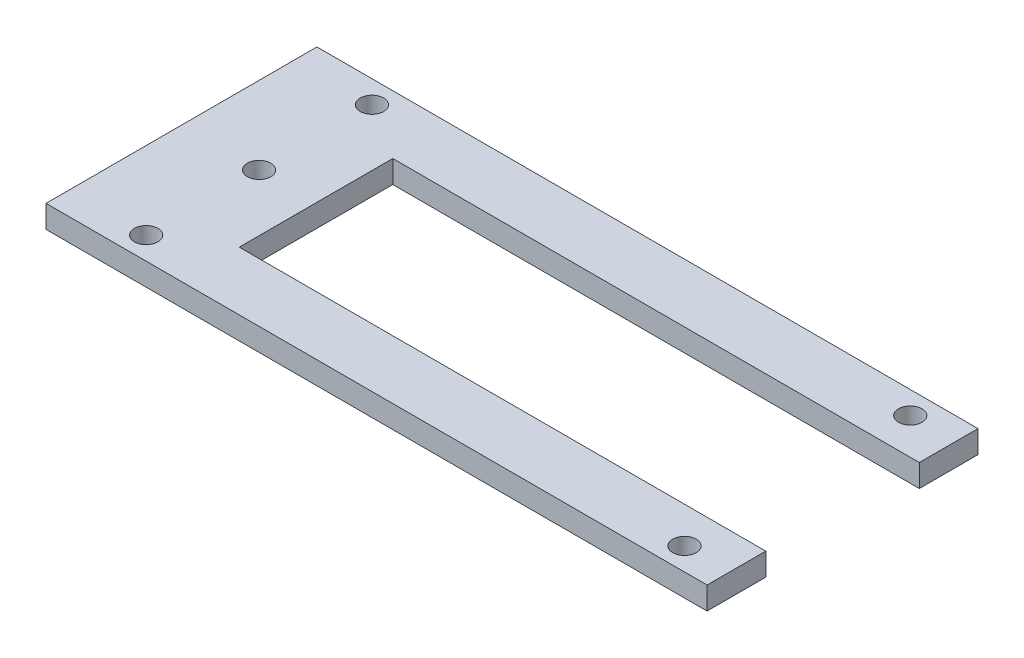
ISO-10303-21;
HEADER;
FILE_DESCRIPTION(('STEP AP214'),'2;1');
FILE_NAME('part.step','',(''),(''),'','','');
FILE_SCHEMA(('AUTOMOTIVE_DESIGN { 1 0 10303 214 1 1 1 1 }'));
ENDSEC;
DATA;
#1=APPLICATION_CONTEXT('core data for automotive mechanical design processes');
#2=APPLICATION_PROTOCOL_DEFINITION('international standard','automotive_design',2000,#1);
#3=PRODUCT_CONTEXT('',#1,'mechanical');
#4=PRODUCT('Part','Part','',(#3));
#5=PRODUCT_RELATED_PRODUCT_CATEGORY('part','',(#4));
#6=PRODUCT_DEFINITION_FORMATION('','',#4);
#7=PRODUCT_DEFINITION_CONTEXT('part definition',#1,'design');
#8=PRODUCT_DEFINITION('design','',#6,#7);
#9=PRODUCT_DEFINITION_SHAPE('','',#8);
#10=(LENGTH_UNIT() NAMED_UNIT(*) SI_UNIT(.MILLI.,.METRE.));
#11=(NAMED_UNIT(*) PLANE_ANGLE_UNIT() SI_UNIT($,.RADIAN.));
#12=(NAMED_UNIT(*) SI_UNIT($,.STERADIAN.) SOLID_ANGLE_UNIT());
#13=UNCERTAINTY_MEASURE_WITH_UNIT(LENGTH_MEASURE(1.E-05),#10,'distance_accuracy_value','');
#14=(GEOMETRIC_REPRESENTATION_CONTEXT(3) GLOBAL_UNCERTAINTY_ASSIGNED_CONTEXT((#13)) GLOBAL_UNIT_ASSIGNED_CONTEXT((#10,
#11,#12)) REPRESENTATION_CONTEXT('',''));
#15=CARTESIAN_POINT('',(0.,0.,0.));
#16=DIRECTION('',(0.,0.,1.));
#17=DIRECTION('',(1.,0.,0.));
#18=AXIS2_PLACEMENT_3D('',#15,#16,#17);
#19=CARTESIAN_POINT('',(46.482,3.175,19.05));
#20=DIRECTION('',(-1.,0.,0.));
#21=DIRECTION('',(0.,0.,1.));
#22=AXIS2_PLACEMENT_3D('',#19,#20,#21);
#23=PLANE('',#22);
#24=DIRECTION('',(0.,0.,-1.));
#25=VECTOR('',#24,1.);
#26=CARTESIAN_POINT('',(46.482,3.175,19.05));
#27=LINE('',#26,#25);
#28=CARTESIAN_POINT('',(46.482,3.175,-10.795));
#29=VERTEX_POINT('',#28);
#30=CARTESIAN_POINT('',(46.482,3.175,-19.05));
#31=VERTEX_POINT('',#30);
#32=EDGE_CURVE('E85',#29,#31,#27,.T.);
#33=ORIENTED_EDGE('',*,*,#32,.F.);
#34=DIRECTION('',(0.,1.,0.));
#35=VECTOR('',#34,1.);
#36=CARTESIAN_POINT('',(46.482,-77.1245601673034,-10.795));
#37=LINE('',#36,#35);
#38=CARTESIAN_POINT('',(46.482,0.,-10.795));
#39=VERTEX_POINT('',#38);
#40=EDGE_CURVE('E141',#39,#29,#37,.T.);
#41=ORIENTED_EDGE('',*,*,#40,.F.);
#42=DIRECTION('',(0.,0.,-1.));
#43=VECTOR('',#42,1.);
#44=CARTESIAN_POINT('',(46.482,0.,19.05));
#45=LINE('',#44,#43);
#46=CARTESIAN_POINT('',(46.482,0.,-19.05));
#47=VERTEX_POINT('',#46);
#48=EDGE_CURVE('E130',#39,#47,#45,.T.);
#49=ORIENTED_EDGE('',*,*,#48,.T.);
#50=DIRECTION('',(0.,-1.,0.));
#51=VECTOR('',#50,1.);
#52=CARTESIAN_POINT('',(46.482,3.175,-19.05));
#53=LINE('',#52,#51);
#54=EDGE_CURVE('E11',#31,#47,#53,.T.);
#55=ORIENTED_EDGE('',*,*,#54,.F.);
#56=EDGE_LOOP('',(#33,#41,#49,#55));
#57=FACE_BOUND('',#56,.T.);
#58=ADVANCED_FACE('F33',(#57),#23,.F.);
#59=CARTESIAN_POINT('',(0.,3.175,0.));
#60=DIRECTION('',(0.,-1.,0.));
#61=DIRECTION('',(0.,0.,-1.));
#62=AXIS2_PLACEMENT_3D('',#59,#60,#61);
#63=PLANE('',#62);
#64=CARTESIAN_POINT('',(40.132,3.175,15.875));
#65=DIRECTION('',(0.,1.,0.));
#66=DIRECTION('',(0.,0.,1.));
#67=AXIS2_PLACEMENT_3D('',#64,#65,#66);
#68=CIRCLE('',#67,1.65099999999997);
#69=CARTESIAN_POINT('',(40.132,3.175,17.526));
#70=VERTEX_POINT('',#69);
#71=EDGE_CURVE('E151',#70,#70,#68,.T.);
#72=ORIENTED_EDGE('',*,*,#71,.F.);
#73=EDGE_LOOP('',(#72));
#74=FACE_BOUND('',#73,.T.);
#75=CARTESIAN_POINT('',(-35.5676927405971,3.175,-15.875));
#76=DIRECTION('',(0.,1.,0.));
#77=DIRECTION('',(0.,0.,1.));
#78=AXIS2_PLACEMENT_3D('',#75,#76,#77);
#79=CIRCLE('',#78,1.65099999999997);
#80=CARTESIAN_POINT('',(-35.5676927405971,3.175,-14.224));
#81=VERTEX_POINT('',#80);
#82=EDGE_CURVE('E163',#81,#81,#79,.T.);
#83=ORIENTED_EDGE('',*,*,#82,.F.);
#84=EDGE_LOOP('',(#83));
#85=FACE_BOUND('',#84,.T.);
#86=DIRECTION('',(0.,0.,1.));
#87=VECTOR('',#86,1.);
#88=CARTESIAN_POINT('',(-27.559,3.175,-10.795));
#89=LINE('',#88,#87);
#90=CARTESIAN_POINT('',(-27.559,3.175,-10.795));
#91=VERTEX_POINT('',#90);
#92=CARTESIAN_POINT('',(-27.559,3.175,10.795));
#93=VERTEX_POINT('',#92);
#94=EDGE_CURVE('E132',#91,#93,#89,.T.);
#95=ORIENTED_EDGE('',*,*,#94,.F.);
#96=DIRECTION('',(-1.,0.,0.));
#97=VECTOR('',#96,1.);
#98=CARTESIAN_POINT('',(46.482,3.175,-10.795));
#99=LINE('',#98,#97);
#100=EDGE_CURVE('E123',#29,#91,#99,.T.);
#101=ORIENTED_EDGE('',*,*,#100,.F.);
#102=ORIENTED_EDGE('',*,*,#32,.T.);
#103=DIRECTION('',(-1.,0.,0.));
#104=VECTOR('',#103,1.);
#105=CARTESIAN_POINT('',(-46.482,3.175,-19.05));
#106=LINE('',#105,#104);
#107=CARTESIAN_POINT('',(-46.482,3.175,-19.05));
#108=VERTEX_POINT('',#107);
#109=EDGE_CURVE('E176',#31,#108,#106,.T.);
#110=ORIENTED_EDGE('',*,*,#109,.T.);
#111=DIRECTION('',(0.,0.,1.));
#112=VECTOR('',#111,1.);
#113=CARTESIAN_POINT('',(-46.482,3.175,19.05));
#114=LINE('',#113,#112);
#115=CARTESIAN_POINT('',(-46.482,3.175,19.05));
#116=VERTEX_POINT('',#115);
#117=EDGE_CURVE('E178',#108,#116,#114,.T.);
#118=ORIENTED_EDGE('',*,*,#117,.T.);
#119=DIRECTION('',(1.,0.,0.));
#120=VECTOR('',#119,1.);
#121=CARTESIAN_POINT('',(-46.482,3.175,19.05));
#122=LINE('',#121,#120);
#123=CARTESIAN_POINT('',(46.482,3.175,19.05));
#124=VERTEX_POINT('',#123);
#125=EDGE_CURVE('E57',#116,#124,#122,.T.);
#126=ORIENTED_EDGE('',*,*,#125,.T.);
#127=CARTESIAN_POINT('',(46.482,3.175,10.795));
#128=VERTEX_POINT('',#127);
#129=EDGE_CURVE('E174',#124,#128,#27,.T.);
#130=ORIENTED_EDGE('',*,*,#129,.T.);
#131=DIRECTION('',(1.,0.,0.));
#132=VECTOR('',#131,1.);
#133=CARTESIAN_POINT('',(46.482,3.175,10.795));
#134=LINE('',#133,#132);
#135=EDGE_CURVE('E48',#93,#128,#134,.T.);
#136=ORIENTED_EDGE('',*,*,#135,.F.);
#137=EDGE_LOOP('',(#95,#101,#102,#110,#118,#126,#130,#136));
#138=FACE_BOUND('',#137,.T.);
#139=CARTESIAN_POINT('',(-35.5676927405971,3.175,15.875));
#140=DIRECTION('',(0.,1.,0.));
#141=DIRECTION('',(0.,0.,1.));
#142=AXIS2_PLACEMENT_3D('',#139,#140,#141);
#143=CIRCLE('',#142,1.65099999999997);
#144=CARTESIAN_POINT('',(-35.5676927405971,3.175,17.526));
#145=VERTEX_POINT('',#144);
#146=EDGE_CURVE('E169',#145,#145,#143,.T.);
#147=ORIENTED_EDGE('',*,*,#146,.F.);
#148=EDGE_LOOP('',(#147));
#149=FACE_BOUND('',#148,.T.);
#150=CARTESIAN_POINT('',(40.132,3.175,-15.875));
#151=DIRECTION('',(0.,1.,0.));
#152=DIRECTION('',(0.,0.,1.));
#153=AXIS2_PLACEMENT_3D('',#150,#151,#152);
#154=CIRCLE('',#153,1.65099999999997);
#155=CARTESIAN_POINT('',(40.132,3.175,-14.224));
#156=VERTEX_POINT('',#155);
#157=EDGE_CURVE('E157',#156,#156,#154,.T.);
#158=ORIENTED_EDGE('',*,*,#157,.F.);
#159=EDGE_LOOP('',(#158));
#160=FACE_BOUND('',#159,.T.);
#161=CARTESIAN_POINT('',(-35.5676927405971,3.175,0.));
#162=DIRECTION('',(0.,1.,0.));
#163=DIRECTION('',(0.,0.,1.));
#164=AXIS2_PLACEMENT_3D('',#161,#162,#163);
#165=CIRCLE('',#164,1.65099999999997);
#166=CARTESIAN_POINT('',(-35.5676927405971,3.175,1.65099999999997));
#167=VERTEX_POINT('',#166);
#168=EDGE_CURVE('E145',#167,#167,#165,.T.);
#169=ORIENTED_EDGE('',*,*,#168,.F.);
#170=EDGE_LOOP('',(#169));
#171=FACE_BOUND('',#170,.T.);
#172=ADVANCED_FACE('F218',(#74,#85,#138,#149,#160,#171),#63,.F.);
#173=CARTESIAN_POINT('',(0.,0.,0.));
#174=DIRECTION('',(0.,-1.,0.));
#175=DIRECTION('',(0.,0.,-1.));
#176=AXIS2_PLACEMENT_3D('',#173,#174,#175);
#177=PLANE('',#176);
#178=DIRECTION('',(-1.,0.,0.));
#179=VECTOR('',#178,1.);
#180=CARTESIAN_POINT('',(46.482,0.,-10.795));
#181=LINE('',#180,#179);
#182=CARTESIAN_POINT('',(-27.559,0.,-10.795));
#183=VERTEX_POINT('',#182);
#184=EDGE_CURVE('E121',#39,#183,#181,.T.);
#185=ORIENTED_EDGE('',*,*,#184,.T.);
#186=DIRECTION('',(0.,0.,1.));
#187=VECTOR('',#186,1.);
#188=CARTESIAN_POINT('',(-27.559,0.,-10.795));
#189=LINE('',#188,#187);
#190=CARTESIAN_POINT('',(-27.559,0.,10.795));
#191=VERTEX_POINT('',#190);
#192=EDGE_CURVE('E108',#183,#191,#189,.T.);
#193=ORIENTED_EDGE('',*,*,#192,.T.);
#194=DIRECTION('',(1.,0.,0.));
#195=VECTOR('',#194,1.);
#196=CARTESIAN_POINT('',(46.482,0.,10.795));
#197=LINE('',#196,#195);
#198=CARTESIAN_POINT('',(46.482,0.,10.795));
#199=VERTEX_POINT('',#198);
#200=EDGE_CURVE('E137',#191,#199,#197,.T.);
#201=ORIENTED_EDGE('',*,*,#200,.T.);
#202=CARTESIAN_POINT('',(46.482,0.,19.05));
#203=VERTEX_POINT('',#202);
#204=EDGE_CURVE('E182',#203,#199,#45,.T.);
#205=ORIENTED_EDGE('',*,*,#204,.F.);
#206=DIRECTION('',(1.,0.,0.));
#207=VECTOR('',#206,1.);
#208=CARTESIAN_POINT('',(-46.482,0.,19.05));
#209=LINE('',#208,#207);
#210=CARTESIAN_POINT('',(-46.482,0.,19.05));
#211=VERTEX_POINT('',#210);
#212=EDGE_CURVE('E78',#211,#203,#209,.T.);
#213=ORIENTED_EDGE('',*,*,#212,.F.);
#214=DIRECTION('',(0.,0.,1.));
#215=VECTOR('',#214,1.);
#216=CARTESIAN_POINT('',(-46.482,0.,19.05));
#217=LINE('',#216,#215);
#218=CARTESIAN_POINT('',(-46.482,0.,-19.05));
#219=VERTEX_POINT('',#218);
#220=EDGE_CURVE('E187',#219,#211,#217,.T.);
#221=ORIENTED_EDGE('',*,*,#220,.F.);
#222=DIRECTION('',(-1.,0.,0.));
#223=VECTOR('',#222,1.);
#224=CARTESIAN_POINT('',(-46.482,0.,-19.05));
#225=LINE('',#224,#223);
#226=EDGE_CURVE('E185',#47,#219,#225,.T.);
#227=ORIENTED_EDGE('',*,*,#226,.F.);
#228=ORIENTED_EDGE('',*,*,#48,.F.);
#229=EDGE_LOOP('',(#185,#193,#201,#205,#213,#221,#227,#228));
#230=FACE_BOUND('',#229,.T.);
#231=CARTESIAN_POINT('',(40.132,0.,15.875));
#232=DIRECTION('',(0.,1.,0.));
#233=DIRECTION('',(0.,0.,1.));
#234=AXIS2_PLACEMENT_3D('',#231,#232,#233);
#235=CIRCLE('',#234,1.65099999999997);
#236=CARTESIAN_POINT('',(40.132,0.,17.526));
#237=VERTEX_POINT('',#236);
#238=EDGE_CURVE('E148',#237,#237,#235,.T.);
#239=ORIENTED_EDGE('',*,*,#238,.T.);
#240=EDGE_LOOP('',(#239));
#241=FACE_BOUND('',#240,.T.);
#242=CARTESIAN_POINT('',(-35.5676927405971,0.,-15.875));
#243=DIRECTION('',(0.,1.,0.));
#244=DIRECTION('',(0.,0.,1.));
#245=AXIS2_PLACEMENT_3D('',#242,#243,#244);
#246=CIRCLE('',#245,1.65099999999997);
#247=CARTESIAN_POINT('',(-35.5676927405971,0.,-14.224));
#248=VERTEX_POINT('',#247);
#249=EDGE_CURVE('E160',#248,#248,#246,.T.);
#250=ORIENTED_EDGE('',*,*,#249,.T.);
#251=EDGE_LOOP('',(#250));
#252=FACE_BOUND('',#251,.T.);
#253=CARTESIAN_POINT('',(-35.5676927405971,0.,15.875));
#254=DIRECTION('',(0.,1.,0.));
#255=DIRECTION('',(0.,0.,1.));
#256=AXIS2_PLACEMENT_3D('',#253,#254,#255);
#257=CIRCLE('',#256,1.65099999999997);
#258=CARTESIAN_POINT('',(-35.5676927405971,0.,17.526));
#259=VERTEX_POINT('',#258);
#260=EDGE_CURVE('E166',#259,#259,#257,.T.);
#261=ORIENTED_EDGE('',*,*,#260,.T.);
#262=EDGE_LOOP('',(#261));
#263=FACE_BOUND('',#262,.T.);
#264=CARTESIAN_POINT('',(40.132,0.,-15.875));
#265=DIRECTION('',(0.,1.,0.));
#266=DIRECTION('',(0.,0.,1.));
#267=AXIS2_PLACEMENT_3D('',#264,#265,#266);
#268=CIRCLE('',#267,1.65099999999997);
#269=CARTESIAN_POINT('',(40.132,0.,-14.224));
#270=VERTEX_POINT('',#269);
#271=EDGE_CURVE('E154',#270,#270,#268,.T.);
#272=ORIENTED_EDGE('',*,*,#271,.T.);
#273=EDGE_LOOP('',(#272));
#274=FACE_BOUND('',#273,.T.);
#275=CARTESIAN_POINT('',(-35.5676927405971,0.,0.));
#276=DIRECTION('',(0.,1.,0.));
#277=DIRECTION('',(0.,0.,1.));
#278=AXIS2_PLACEMENT_3D('',#275,#276,#277);
#279=CIRCLE('',#278,1.65099999999997);
#280=CARTESIAN_POINT('',(-35.5676927405971,0.,1.65099999999997));
#281=VERTEX_POINT('',#280);
#282=EDGE_CURVE('E144',#281,#281,#279,.T.);
#283=ORIENTED_EDGE('',*,*,#282,.T.);
#284=EDGE_LOOP('',(#283));
#285=FACE_BOUND('',#284,.T.);
#286=ADVANCED_FACE('F127',(#230,#241,#252,#263,#274,#285),#177,.T.);
#287=ORIENTED_EDGE('',*,*,#204,.T.);
#288=DIRECTION('',(0.,1.,0.));
#289=VECTOR('',#288,1.);
#290=CARTESIAN_POINT('',(46.482,-77.1245601673034,10.795));
#291=LINE('',#290,#289);
#292=EDGE_CURVE('E138',#199,#128,#291,.T.);
#293=ORIENTED_EDGE('',*,*,#292,.T.);
#294=ORIENTED_EDGE('',*,*,#129,.F.);
#295=DIRECTION('',(0.,-1.,0.));
#296=VECTOR('',#295,1.);
#297=CARTESIAN_POINT('',(46.482,3.175,19.05));
#298=LINE('',#297,#296);
#299=EDGE_CURVE('E181',#124,#203,#298,.T.);
#300=ORIENTED_EDGE('',*,*,#299,.T.);
#301=EDGE_LOOP('',(#287,#293,#294,#300));
#302=FACE_BOUND('',#301,.T.);
#303=ADVANCED_FACE('F35',(#302),#23,.F.);
#304=CARTESIAN_POINT('',(-46.482,3.175,-19.05));
#305=DIRECTION('',(0.,0.,1.));
#306=DIRECTION('',(1.,0.,0.));
#307=AXIS2_PLACEMENT_3D('',#304,#305,#306);
#308=PLANE('',#307);
#309=ORIENTED_EDGE('',*,*,#226,.T.);
#310=DIRECTION('',(0.,-1.,0.));
#311=VECTOR('',#310,1.);
#312=CARTESIAN_POINT('',(-46.482,3.175,-19.05));
#313=LINE('',#312,#311);
#314=EDGE_CURVE('E41',#108,#219,#313,.T.);
#315=ORIENTED_EDGE('',*,*,#314,.F.);
#316=ORIENTED_EDGE('',*,*,#109,.F.);
#317=ORIENTED_EDGE('',*,*,#54,.T.);
#318=EDGE_LOOP('',(#309,#315,#316,#317));
#319=FACE_BOUND('',#318,.T.);
#320=ADVANCED_FACE('F214',(#319),#308,.F.);
#321=CARTESIAN_POINT('',(-46.482,3.175,19.05));
#322=DIRECTION('',(1.,0.,0.));
#323=DIRECTION('',(0.,0.,-1.));
#324=AXIS2_PLACEMENT_3D('',#321,#322,#323);
#325=PLANE('',#324);
#326=ORIENTED_EDGE('',*,*,#220,.T.);
#327=DIRECTION('',(0.,-1.,0.));
#328=VECTOR('',#327,1.);
#329=CARTESIAN_POINT('',(-46.482,3.175,19.05));
#330=LINE('',#329,#328);
#331=EDGE_CURVE('E191',#116,#211,#330,.T.);
#332=ORIENTED_EDGE('',*,*,#331,.F.);
#333=ORIENTED_EDGE('',*,*,#117,.F.);
#334=ORIENTED_EDGE('',*,*,#314,.T.);
#335=EDGE_LOOP('',(#326,#332,#333,#334));
#336=FACE_BOUND('',#335,.T.);
#337=ADVANCED_FACE('F197',(#336),#325,.F.);
#338=CARTESIAN_POINT('',(-46.482,3.175,19.05));
#339=DIRECTION('',(0.,0.,-1.));
#340=DIRECTION('',(-1.,0.,0.));
#341=AXIS2_PLACEMENT_3D('',#338,#339,#340);
#342=PLANE('',#341);
#343=ORIENTED_EDGE('',*,*,#212,.T.);
#344=ORIENTED_EDGE('',*,*,#299,.F.);
#345=ORIENTED_EDGE('',*,*,#125,.F.);
#346=ORIENTED_EDGE('',*,*,#331,.T.);
#347=EDGE_LOOP('',(#343,#344,#345,#346));
#348=FACE_BOUND('',#347,.T.);
#349=ADVANCED_FACE('F203',(#348),#342,.F.);
#350=CARTESIAN_POINT('',(-35.5676927405971,3.175,15.875));
#351=DIRECTION('',(0.,-1.,0.));
#352=DIRECTION('',(0.,0.,-1.));
#353=AXIS2_PLACEMENT_3D('',#350,#351,#352);
#354=CYLINDRICAL_SURFACE('',#353,1.65099999999997);
#355=ORIENTED_EDGE('',*,*,#146,.T.);
#356=EDGE_LOOP('',(#355));
#357=FACE_BOUND('',#356,.T.);
#358=ORIENTED_EDGE('',*,*,#260,.F.);
#359=EDGE_LOOP('',(#358));
#360=FACE_BOUND('',#359,.T.);
#361=ADVANCED_FACE('F205',(#357,#360),#354,.F.);
#362=CARTESIAN_POINT('',(-35.5676927405971,3.175,-15.875));
#363=DIRECTION('',(0.,-1.,0.));
#364=DIRECTION('',(0.,0.,-1.));
#365=AXIS2_PLACEMENT_3D('',#362,#363,#364);
#366=CYLINDRICAL_SURFACE('',#365,1.65099999999997);
#367=ORIENTED_EDGE('',*,*,#82,.T.);
#368=EDGE_LOOP('',(#367));
#369=FACE_BOUND('',#368,.T.);
#370=ORIENTED_EDGE('',*,*,#249,.F.);
#371=EDGE_LOOP('',(#370));
#372=FACE_BOUND('',#371,.T.);
#373=ADVANCED_FACE('F211',(#369,#372),#366,.F.);
#374=CARTESIAN_POINT('',(40.132,3.175,-15.875));
#375=DIRECTION('',(0.,-1.,0.));
#376=DIRECTION('',(0.,0.,-1.));
#377=AXIS2_PLACEMENT_3D('',#374,#375,#376);
#378=CYLINDRICAL_SURFACE('',#377,1.65099999999997);
#379=ORIENTED_EDGE('',*,*,#157,.T.);
#380=EDGE_LOOP('',(#379));
#381=FACE_BOUND('',#380,.T.);
#382=ORIENTED_EDGE('',*,*,#271,.F.);
#383=EDGE_LOOP('',(#382));
#384=FACE_BOUND('',#383,.T.);
#385=ADVANCED_FACE('F235',(#381,#384),#378,.F.);
#386=CARTESIAN_POINT('',(40.132,3.175,15.875));
#387=DIRECTION('',(0.,-1.,0.));
#388=DIRECTION('',(0.,0.,-1.));
#389=AXIS2_PLACEMENT_3D('',#386,#387,#388);
#390=CYLINDRICAL_SURFACE('',#389,1.65099999999997);
#391=ORIENTED_EDGE('',*,*,#71,.T.);
#392=EDGE_LOOP('',(#391));
#393=FACE_BOUND('',#392,.T.);
#394=ORIENTED_EDGE('',*,*,#238,.F.);
#395=EDGE_LOOP('',(#394));
#396=FACE_BOUND('',#395,.T.);
#397=ADVANCED_FACE('F239',(#393,#396),#390,.F.);
#398=CARTESIAN_POINT('',(-35.5676927405971,3.175,0.));
#399=DIRECTION('',(0.,-1.,0.));
#400=DIRECTION('',(0.,0.,-1.));
#401=AXIS2_PLACEMENT_3D('',#398,#399,#400);
#402=CYLINDRICAL_SURFACE('',#401,1.65099999999997);
#403=ORIENTED_EDGE('',*,*,#168,.T.);
#404=EDGE_LOOP('',(#403));
#405=FACE_BOUND('',#404,.T.);
#406=ORIENTED_EDGE('',*,*,#282,.F.);
#407=EDGE_LOOP('',(#406));
#408=FACE_BOUND('',#407,.T.);
#409=ADVANCED_FACE('F243',(#405,#408),#402,.F.);
#410=CARTESIAN_POINT('',(46.482,-77.1245601673034,-10.795));
#411=DIRECTION('',(0.,0.,-1.));
#412=DIRECTION('',(-1.,0.,0.));
#413=AXIS2_PLACEMENT_3D('',#410,#411,#412);
#414=PLANE('',#413);
#415=ORIENTED_EDGE('',*,*,#40,.T.);
#416=ORIENTED_EDGE('',*,*,#100,.T.);
#417=DIRECTION('',(0.,1.,0.));
#418=VECTOR('',#417,1.);
#419=CARTESIAN_POINT('',(-27.559,-77.1245601673034,-10.795));
#420=LINE('',#419,#418);
#421=EDGE_CURVE('E112',#183,#91,#420,.T.);
#422=ORIENTED_EDGE('',*,*,#421,.F.);
#423=ORIENTED_EDGE('',*,*,#184,.F.);
#424=EDGE_LOOP('',(#415,#416,#422,#423));
#425=FACE_BOUND('',#424,.T.);
#426=ADVANCED_FACE('F120',(#425),#414,.F.);
#427=CARTESIAN_POINT('',(-27.559,-77.1245601673034,-10.795));
#428=DIRECTION('',(-1.,0.,0.));
#429=DIRECTION('',(0.,0.,1.));
#430=AXIS2_PLACEMENT_3D('',#427,#428,#429);
#431=PLANE('',#430);
#432=ORIENTED_EDGE('',*,*,#421,.T.);
#433=ORIENTED_EDGE('',*,*,#94,.T.);
#434=DIRECTION('',(0.,1.,0.));
#435=VECTOR('',#434,1.);
#436=CARTESIAN_POINT('',(-27.559,-77.1245601673034,10.795));
#437=LINE('',#436,#435);
#438=EDGE_CURVE('E114',#191,#93,#437,.T.);
#439=ORIENTED_EDGE('',*,*,#438,.F.);
#440=ORIENTED_EDGE('',*,*,#192,.F.);
#441=EDGE_LOOP('',(#432,#433,#439,#440));
#442=FACE_BOUND('',#441,.T.);
#443=ADVANCED_FACE('F110',(#442),#431,.F.);
#444=CARTESIAN_POINT('',(46.482,-77.1245601673034,10.795));
#445=DIRECTION('',(0.,0.,1.));
#446=DIRECTION('',(1.,0.,0.));
#447=AXIS2_PLACEMENT_3D('',#444,#445,#446);
#448=PLANE('',#447);
#449=ORIENTED_EDGE('',*,*,#438,.T.);
#450=ORIENTED_EDGE('',*,*,#135,.T.);
#451=ORIENTED_EDGE('',*,*,#292,.F.);
#452=ORIENTED_EDGE('',*,*,#200,.F.);
#453=EDGE_LOOP('',(#449,#450,#451,#452));
#454=FACE_BOUND('',#453,.T.);
#455=ADVANCED_FACE('F252',(#454),#448,.F.);
#456=CLOSED_SHELL('',(#58,#172,#286,#303,#320,#337,#349,#361,#373,#385,#397,#409,#426,#443,#455));
#457=MANIFOLD_SOLID_BREP('B2',#456);
#458=ADVANCED_BREP_SHAPE_REPRESENTATION('',(#18,#457),#14);
#459=SHAPE_DEFINITION_REPRESENTATION(#9,#458);
ENDSEC;
END-ISO-10303-21;
